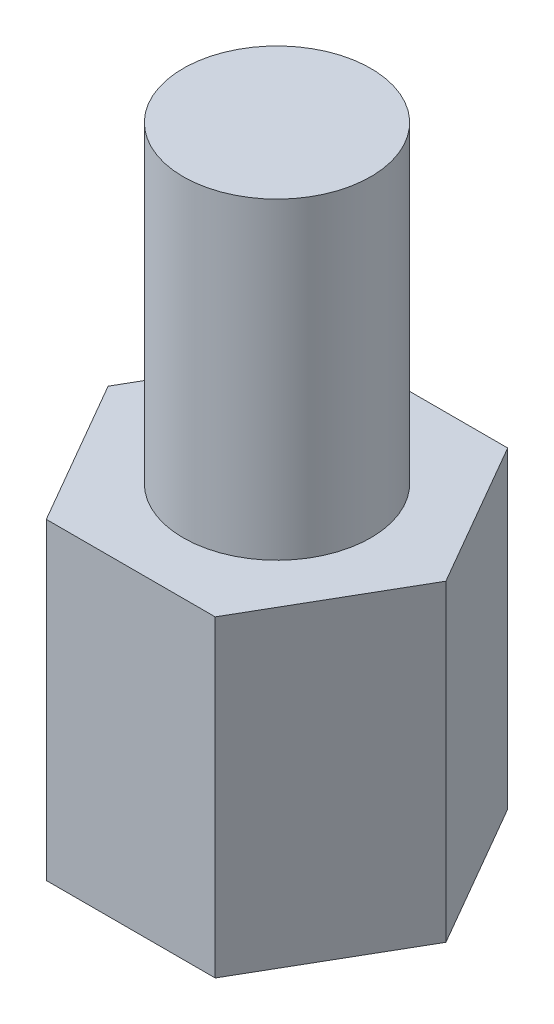
ISO-10303-21;
HEADER;
FILE_DESCRIPTION(('STEP AP214'),'2;1');
FILE_NAME('part.step','',(''),(''),'','','');
FILE_SCHEMA(('AUTOMOTIVE_DESIGN { 1 0 10303 214 1 1 1 1 }'));
ENDSEC;
DATA;
#1=APPLICATION_CONTEXT('core data for automotive mechanical design processes');
#2=APPLICATION_PROTOCOL_DEFINITION('international standard','automotive_design',2000,#1);
#3=PRODUCT_CONTEXT('',#1,'mechanical');
#4=PRODUCT('Part','Part','',(#3));
#5=PRODUCT_RELATED_PRODUCT_CATEGORY('part','',(#4));
#6=PRODUCT_DEFINITION_FORMATION('','',#4);
#7=PRODUCT_DEFINITION_CONTEXT('part definition',#1,'design');
#8=PRODUCT_DEFINITION('design','',#6,#7);
#9=PRODUCT_DEFINITION_SHAPE('','',#8);
#10=(LENGTH_UNIT() NAMED_UNIT(*) SI_UNIT(.MILLI.,.METRE.));
#11=(NAMED_UNIT(*) PLANE_ANGLE_UNIT() SI_UNIT($,.RADIAN.));
#12=(NAMED_UNIT(*) SI_UNIT($,.STERADIAN.) SOLID_ANGLE_UNIT());
#13=UNCERTAINTY_MEASURE_WITH_UNIT(LENGTH_MEASURE(1.E-05),#10,'distance_accuracy_value','');
#14=(GEOMETRIC_REPRESENTATION_CONTEXT(3) GLOBAL_UNCERTAINTY_ASSIGNED_CONTEXT((#13)) GLOBAL_UNIT_ASSIGNED_CONTEXT((#10,
#11,#12)) REPRESENTATION_CONTEXT('',''));
#15=CARTESIAN_POINT('',(0.,0.,0.));
#16=DIRECTION('',(0.,0.,1.));
#17=DIRECTION('',(1.,0.,0.));
#18=AXIS2_PLACEMENT_3D('',#15,#16,#17);
#19=CARTESIAN_POINT('',(0.,10.,0.));
#20=DIRECTION('',(0.,-1.,0.));
#21=DIRECTION('',(0.,0.,-1.));
#22=AXIS2_PLACEMENT_3D('',#19,#20,#21);
#23=CYLINDRICAL_SURFACE('',#22,1.5);
#24=CARTESIAN_POINT('',(0.,5.,0.));
#25=DIRECTION('',(0.,1.,0.));
#26=DIRECTION('',(0.,0.,1.));
#27=AXIS2_PLACEMENT_3D('',#24,#25,#26);
#28=CIRCLE('',#27,1.5);
#29=CARTESIAN_POINT('',(0.,5.,1.5));
#30=VERTEX_POINT('',#29);
#31=EDGE_CURVE('E50',#30,#30,#28,.T.);
#32=ORIENTED_EDGE('',*,*,#31,.T.);
#33=EDGE_LOOP('',(#32));
#34=FACE_BOUND('',#33,.T.);
#35=CARTESIAN_POINT('',(0.,10.,0.));
#36=DIRECTION('',(0.,1.,0.));
#37=DIRECTION('',(0.,0.,1.));
#38=AXIS2_PLACEMENT_3D('',#35,#36,#37);
#39=CIRCLE('',#38,1.5);
#40=CARTESIAN_POINT('',(0.,10.,1.5));
#41=VERTEX_POINT('',#40);
#42=EDGE_CURVE('E11',#41,#41,#39,.T.);
#43=ORIENTED_EDGE('',*,*,#42,.F.);
#44=EDGE_LOOP('',(#43));
#45=FACE_BOUND('',#44,.T.);
#46=ADVANCED_FACE('F46',(#34,#45),#23,.T.);
#47=CARTESIAN_POINT('',(0.,10.,0.));
#48=DIRECTION('',(0.,1.,0.));
#49=DIRECTION('',(0.,0.,1.));
#50=AXIS2_PLACEMENT_3D('',#47,#48,#49);
#51=PLANE('',#50);
#52=ORIENTED_EDGE('',*,*,#42,.T.);
#53=EDGE_LOOP('',(#52));
#54=FACE_BOUND('',#53,.T.);
#55=ADVANCED_FACE('F62',(#54),#51,.T.);
#56=CARTESIAN_POINT('',(0.,5.,0.));
#57=DIRECTION('',(0.,1.,0.));
#58=DIRECTION('',(0.,0.,1.));
#59=AXIS2_PLACEMENT_3D('',#56,#57,#58);
#60=PLANE('',#59);
#61=ORIENTED_EDGE('',*,*,#31,.F.);
#62=EDGE_LOOP('',(#61));
#63=FACE_BOUND('',#62,.T.);
#64=ADVANCED_FACE('F48',(#63),#60,.F.);
#65=CLOSED_SHELL('',(#46,#55,#64));
#66=MANIFOLD_SOLID_BREP('B2',#65);
#67=CARTESIAN_POINT('',(-1.35,5.,2.33826859021799));
#68=DIRECTION('',(0.,0.,-1.));
#69=DIRECTION('',(-1.,0.,0.));
#70=AXIS2_PLACEMENT_3D('',#67,#68,#69);
#71=PLANE('',#70);
#72=DIRECTION('',(1.,0.,0.));
#73=VECTOR('',#72,1.);
#74=CARTESIAN_POINT('',(-1.35,0.,2.33826859021799));
#75=LINE('',#74,#73);
#76=CARTESIAN_POINT('',(-1.35,0.,2.33826859021799));
#77=VERTEX_POINT('',#76);
#78=CARTESIAN_POINT('',(1.35,0.,2.33826859021799));
#79=VERTEX_POINT('',#78);
#80=EDGE_CURVE('E139',#77,#79,#75,.T.);
#81=ORIENTED_EDGE('',*,*,#80,.T.);
#82=DIRECTION('',(0.,-1.,0.));
#83=VECTOR('',#82,1.);
#84=CARTESIAN_POINT('',(1.35,5.,2.33826859021799));
#85=LINE('',#84,#83);
#86=CARTESIAN_POINT('',(1.35,5.,2.33826859021799));
#87=VERTEX_POINT('',#86);
#88=EDGE_CURVE('E174',#87,#79,#85,.T.);
#89=ORIENTED_EDGE('',*,*,#88,.F.);
#90=DIRECTION('',(1.,0.,0.));
#91=VECTOR('',#90,1.);
#92=CARTESIAN_POINT('',(-1.35,5.,2.33826859021799));
#93=LINE('',#92,#91);
#94=CARTESIAN_POINT('',(-1.35,5.,2.33826859021799));
#95=VERTEX_POINT('',#94);
#96=EDGE_CURVE('E110',#95,#87,#93,.T.);
#97=ORIENTED_EDGE('',*,*,#96,.F.);
#98=DIRECTION('',(0.,-1.,0.));
#99=VECTOR('',#98,1.);
#100=CARTESIAN_POINT('',(-1.35,5.,2.33826859021799));
#101=LINE('',#100,#99);
#102=EDGE_CURVE('E170',#95,#77,#101,.T.);
#103=ORIENTED_EDGE('',*,*,#102,.T.);
#104=EDGE_LOOP('',(#81,#89,#97,#103));
#105=FACE_BOUND('',#104,.T.);
#106=ADVANCED_FACE('F92',(#105),#71,.F.);
#107=CARTESIAN_POINT('',(-2.7,5.,0.));
#108=DIRECTION('',(0.866025403784439,0.,-0.5));
#109=DIRECTION('',(-0.5,0.,-0.866025403784439));
#110=AXIS2_PLACEMENT_3D('',#107,#108,#109);
#111=PLANE('',#110);
#112=DIRECTION('',(0.5,0.,0.866025403784439));
#113=VECTOR('',#112,1.);
#114=CARTESIAN_POINT('',(-2.7,0.,0.));
#115=LINE('',#114,#113);
#116=CARTESIAN_POINT('',(-2.7,0.,0.));
#117=VERTEX_POINT('',#116);
#118=EDGE_CURVE('E133',#117,#77,#115,.T.);
#119=ORIENTED_EDGE('',*,*,#118,.T.);
#120=ORIENTED_EDGE('',*,*,#102,.F.);
#121=DIRECTION('',(0.5,0.,0.866025403784439));
#122=VECTOR('',#121,1.);
#123=CARTESIAN_POINT('',(-2.7,5.,0.));
#124=LINE('',#123,#122);
#125=CARTESIAN_POINT('',(-2.7,5.,0.));
#126=VERTEX_POINT('',#125);
#127=EDGE_CURVE('E158',#126,#95,#124,.T.);
#128=ORIENTED_EDGE('',*,*,#127,.F.);
#129=DIRECTION('',(0.,-1.,0.));
#130=VECTOR('',#129,1.);
#131=CARTESIAN_POINT('',(-2.7,5.,0.));
#132=LINE('',#131,#130);
#133=EDGE_CURVE('E165',#126,#117,#132,.T.);
#134=ORIENTED_EDGE('',*,*,#133,.T.);
#135=EDGE_LOOP('',(#119,#120,#128,#134));
#136=FACE_BOUND('',#135,.T.);
#137=ADVANCED_FACE('F172',(#136),#111,.F.);
#138=CARTESIAN_POINT('',(-1.35,5.,-2.33826859021799));
#139=DIRECTION('',(0.866025403784439,0.,0.5));
#140=DIRECTION('',(0.5,0.,-0.866025403784439));
#141=AXIS2_PLACEMENT_3D('',#138,#139,#140);
#142=PLANE('',#141);
#143=DIRECTION('',(-0.5,0.,0.866025403784439));
#144=VECTOR('',#143,1.);
#145=CARTESIAN_POINT('',(-1.35,0.,-2.33826859021799));
#146=LINE('',#145,#144);
#147=CARTESIAN_POINT('',(-1.35,0.,-2.33826859021799));
#148=VERTEX_POINT('',#147);
#149=EDGE_CURVE('E168',#148,#117,#146,.T.);
#150=ORIENTED_EDGE('',*,*,#149,.T.);
#151=ORIENTED_EDGE('',*,*,#133,.F.);
#152=DIRECTION('',(-0.5,0.,0.866025403784439));
#153=VECTOR('',#152,1.);
#154=CARTESIAN_POINT('',(-1.35,5.,-2.33826859021799));
#155=LINE('',#154,#153);
#156=CARTESIAN_POINT('',(-1.35,5.,-2.33826859021799));
#157=VERTEX_POINT('',#156);
#158=EDGE_CURVE('E154',#157,#126,#155,.T.);
#159=ORIENTED_EDGE('',*,*,#158,.F.);
#160=DIRECTION('',(0.,-1.,0.));
#161=VECTOR('',#160,1.);
#162=CARTESIAN_POINT('',(-1.35,5.,-2.33826859021799));
#163=LINE('',#162,#161);
#164=EDGE_CURVE('E169',#157,#148,#163,.T.);
#165=ORIENTED_EDGE('',*,*,#164,.T.);
#166=EDGE_LOOP('',(#150,#151,#159,#165));
#167=FACE_BOUND('',#166,.T.);
#168=ADVANCED_FACE('F166',(#167),#142,.F.);
#169=CARTESIAN_POINT('',(1.35,5.,-2.33826859021799));
#170=DIRECTION('',(0.,0.,1.));
#171=DIRECTION('',(1.,0.,0.));
#172=AXIS2_PLACEMENT_3D('',#169,#170,#171);
#173=PLANE('',#172);
#174=DIRECTION('',(-1.,0.,0.));
#175=VECTOR('',#174,1.);
#176=CARTESIAN_POINT('',(1.35,0.,-2.33826859021799));
#177=LINE('',#176,#175);
#178=CARTESIAN_POINT('',(1.35,0.,-2.33826859021799));
#179=VERTEX_POINT('',#178);
#180=EDGE_CURVE('E183',#179,#148,#177,.T.);
#181=ORIENTED_EDGE('',*,*,#180,.T.);
#182=ORIENTED_EDGE('',*,*,#164,.F.);
#183=DIRECTION('',(-1.,0.,0.));
#184=VECTOR('',#183,1.);
#185=CARTESIAN_POINT('',(1.35,5.,-2.33826859021799));
#186=LINE('',#185,#184);
#187=CARTESIAN_POINT('',(1.35,5.,-2.33826859021799));
#188=VERTEX_POINT('',#187);
#189=EDGE_CURVE('E160',#188,#157,#186,.T.);
#190=ORIENTED_EDGE('',*,*,#189,.F.);
#191=DIRECTION('',(0.,-1.,0.));
#192=VECTOR('',#191,1.);
#193=CARTESIAN_POINT('',(1.35,5.,-2.33826859021799));
#194=LINE('',#193,#192);
#195=EDGE_CURVE('E102',#188,#179,#194,.T.);
#196=ORIENTED_EDGE('',*,*,#195,.T.);
#197=EDGE_LOOP('',(#181,#182,#190,#196));
#198=FACE_BOUND('',#197,.T.);
#199=ADVANCED_FACE('F195',(#198),#173,.F.);
#200=CARTESIAN_POINT('',(2.7,5.,0.));
#201=DIRECTION('',(-0.866025403784439,0.,0.5));
#202=DIRECTION('',(0.5,0.,0.866025403784439));
#203=AXIS2_PLACEMENT_3D('',#200,#201,#202);
#204=PLANE('',#203);
#205=DIRECTION('',(-0.5,0.,-0.866025403784438));
#206=VECTOR('',#205,1.);
#207=CARTESIAN_POINT('',(2.7,0.,0.));
#208=LINE('',#207,#206);
#209=CARTESIAN_POINT('',(2.7,0.,0.));
#210=VERTEX_POINT('',#209);
#211=EDGE_CURVE('E181',#210,#179,#208,.T.);
#212=ORIENTED_EDGE('',*,*,#211,.T.);
#213=ORIENTED_EDGE('',*,*,#195,.F.);
#214=DIRECTION('',(-0.5,0.,-0.866025403784438));
#215=VECTOR('',#214,1.);
#216=CARTESIAN_POINT('',(2.7,5.,0.));
#217=LINE('',#216,#215);
#218=CARTESIAN_POINT('',(2.7,5.,0.));
#219=VERTEX_POINT('',#218);
#220=EDGE_CURVE('E147',#219,#188,#217,.T.);
#221=ORIENTED_EDGE('',*,*,#220,.F.);
#222=DIRECTION('',(0.,-1.,0.));
#223=VECTOR('',#222,1.);
#224=CARTESIAN_POINT('',(2.7,5.,0.));
#225=LINE('',#224,#223);
#226=EDGE_CURVE('E44',#219,#210,#225,.T.);
#227=ORIENTED_EDGE('',*,*,#226,.T.);
#228=EDGE_LOOP('',(#212,#213,#221,#227));
#229=FACE_BOUND('',#228,.T.);
#230=ADVANCED_FACE('F214',(#229),#204,.F.);
#231=CARTESIAN_POINT('',(0.,0.,0.));
#232=DIRECTION('',(0.,1.,0.));
#233=DIRECTION('',(0.,0.,1.));
#234=AXIS2_PLACEMENT_3D('',#231,#232,#233);
#235=PLANE('',#234);
#236=CARTESIAN_POINT('',(0.,0.,0.));
#237=DIRECTION('',(0.,1.,0.));
#238=DIRECTION('',(0.,0.,1.));
#239=AXIS2_PLACEMENT_3D('',#236,#237,#238);
#240=CIRCLE('',#239,1.5);
#241=CARTESIAN_POINT('',(0.,0.,1.5));
#242=VERTEX_POINT('',#241);
#243=EDGE_CURVE('E96',#242,#242,#240,.F.);
#244=ORIENTED_EDGE('',*,*,#243,.F.);
#245=EDGE_LOOP('',(#244));
#246=FACE_BOUND('',#245,.T.);
#247=DIRECTION('',(0.5,0.,-0.866025403784439));
#248=VECTOR('',#247,1.);
#249=CARTESIAN_POINT('',(1.35,0.,2.33826859021799));
#250=LINE('',#249,#248);
#251=EDGE_CURVE('E178',#79,#210,#250,.T.);
#252=ORIENTED_EDGE('',*,*,#251,.F.);
#253=ORIENTED_EDGE('',*,*,#80,.F.);
#254=ORIENTED_EDGE('',*,*,#118,.F.);
#255=ORIENTED_EDGE('',*,*,#149,.F.);
#256=ORIENTED_EDGE('',*,*,#180,.F.);
#257=ORIENTED_EDGE('',*,*,#211,.F.);
#258=EDGE_LOOP('',(#252,#253,#254,#255,#256,#257));
#259=FACE_BOUND('',#258,.T.);
#260=ADVANCED_FACE('F198',(#246,#259),#235,.F.);
#261=CARTESIAN_POINT('',(1.35,5.,2.33826859021799));
#262=DIRECTION('',(-0.866025403784439,0.,-0.5));
#263=DIRECTION('',(-0.5,0.,0.866025403784439));
#264=AXIS2_PLACEMENT_3D('',#261,#262,#263);
#265=PLANE('',#264);
#266=ORIENTED_EDGE('',*,*,#251,.T.);
#267=ORIENTED_EDGE('',*,*,#226,.F.);
#268=DIRECTION('',(0.5,0.,-0.866025403784439));
#269=VECTOR('',#268,1.);
#270=CARTESIAN_POINT('',(1.35,5.,2.33826859021799));
#271=LINE('',#270,#269);
#272=EDGE_CURVE('E188',#87,#219,#271,.T.);
#273=ORIENTED_EDGE('',*,*,#272,.F.);
#274=ORIENTED_EDGE('',*,*,#88,.T.);
#275=EDGE_LOOP('',(#266,#267,#273,#274));
#276=FACE_BOUND('',#275,.T.);
#277=ADVANCED_FACE('F94',(#276),#265,.F.);
#278=CARTESIAN_POINT('',(0.,5.,0.));
#279=DIRECTION('',(0.,1.,0.));
#280=DIRECTION('',(0.,0.,1.));
#281=AXIS2_PLACEMENT_3D('',#278,#279,#280);
#282=PLANE('',#281);
#283=CARTESIAN_POINT('',(0.,5.,0.));
#284=DIRECTION('',(0.,1.,0.));
#285=DIRECTION('',(0.,0.,1.));
#286=AXIS2_PLACEMENT_3D('',#283,#284,#285);
#287=CIRCLE('',#286,1.5);
#288=CARTESIAN_POINT('',(0.,5.,1.5));
#289=VERTEX_POINT('',#288);
#290=EDGE_CURVE('E226',#289,#289,#287,.T.);
#291=ORIENTED_EDGE('',*,*,#290,.F.);
#292=EDGE_LOOP('',(#291));
#293=FACE_BOUND('',#292,.T.);
#294=ORIENTED_EDGE('',*,*,#272,.T.);
#295=ORIENTED_EDGE('',*,*,#220,.T.);
#296=ORIENTED_EDGE('',*,*,#189,.T.);
#297=ORIENTED_EDGE('',*,*,#158,.T.);
#298=ORIENTED_EDGE('',*,*,#127,.T.);
#299=ORIENTED_EDGE('',*,*,#96,.T.);
#300=EDGE_LOOP('',(#294,#295,#296,#297,#298,#299));
#301=FACE_BOUND('',#300,.T.);
#302=ADVANCED_FACE('F156',(#293,#301),#282,.T.);
#303=CARTESIAN_POINT('',(0.,5.,0.));
#304=DIRECTION('',(0.,-1.,0.));
#305=DIRECTION('',(0.,0.,-1.));
#306=AXIS2_PLACEMENT_3D('',#303,#304,#305);
#307=CYLINDRICAL_SURFACE('',#306,1.5);
#308=ORIENTED_EDGE('',*,*,#290,.T.);
#309=EDGE_LOOP('',(#308));
#310=FACE_BOUND('',#309,.T.);
#311=ORIENTED_EDGE('',*,*,#243,.T.);
#312=EDGE_LOOP('',(#311));
#313=FACE_BOUND('',#312,.T.);
#314=ADVANCED_FACE('F233',(#310,#313),#307,.F.);
#315=CLOSED_SHELL('',(#106,#137,#168,#199,#230,#260,#277,#302,#314));
#316=MANIFOLD_SOLID_BREP('B6',#315);
#317=ADVANCED_BREP_SHAPE_REPRESENTATION('',(#18,#66,#316),#14);
#318=SHAPE_DEFINITION_REPRESENTATION(#9,#317);
ENDSEC;
END-ISO-10303-21;
